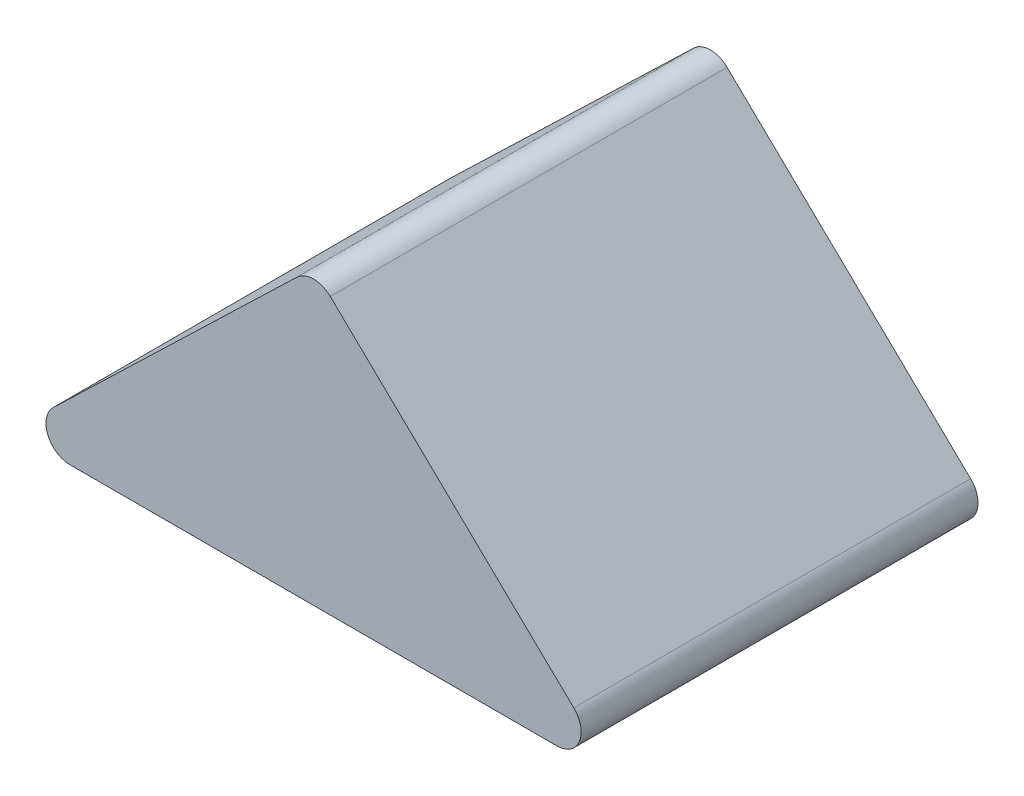
ISO-10303-21;
HEADER;
FILE_DESCRIPTION(('STEP AP214'),'2;1');
FILE_NAME('part.step','',(''),(''),'','','');
FILE_SCHEMA(('AUTOMOTIVE_DESIGN { 1 0 10303 214 1 1 1 1 }'));
ENDSEC;
DATA;
#1=APPLICATION_CONTEXT('core data for automotive mechanical design processes');
#2=APPLICATION_PROTOCOL_DEFINITION('international standard','automotive_design',2000,#1);
#3=PRODUCT_CONTEXT('',#1,'mechanical');
#4=PRODUCT('Part','Part','',(#3));
#5=PRODUCT_RELATED_PRODUCT_CATEGORY('part','',(#4));
#6=PRODUCT_DEFINITION_FORMATION('','',#4);
#7=PRODUCT_DEFINITION_CONTEXT('part definition',#1,'design');
#8=PRODUCT_DEFINITION('design','',#6,#7);
#9=PRODUCT_DEFINITION_SHAPE('','',#8);
#10=(LENGTH_UNIT() NAMED_UNIT(*) SI_UNIT(.MILLI.,.METRE.));
#11=(NAMED_UNIT(*) PLANE_ANGLE_UNIT() SI_UNIT($,.RADIAN.));
#12=(NAMED_UNIT(*) SI_UNIT($,.STERADIAN.) SOLID_ANGLE_UNIT());
#13=UNCERTAINTY_MEASURE_WITH_UNIT(LENGTH_MEASURE(1.E-05),#10,'distance_accuracy_value','');
#14=(GEOMETRIC_REPRESENTATION_CONTEXT(3) GLOBAL_UNCERTAINTY_ASSIGNED_CONTEXT((#13)) GLOBAL_UNIT_ASSIGNED_CONTEXT((#10,
#11,#12)) REPRESENTATION_CONTEXT('',''));
#15=CARTESIAN_POINT('',(0.,0.,0.));
#16=DIRECTION('',(0.,0.,1.));
#17=DIRECTION('',(1.,0.,0.));
#18=AXIS2_PLACEMENT_3D('',#15,#16,#17);
#19=CARTESIAN_POINT('',(0.,2.,33.));
#20=DIRECTION('',(0.,0.,-1.));
#21=DIRECTION('',(-1.,0.,0.));
#22=AXIS2_PLACEMENT_3D('',#19,#20,#21);
#23=CYLINDRICAL_SURFACE('',#22,1.99999999999999);
#24=CARTESIAN_POINT('',(0.,2.,0.));
#25=DIRECTION('',(0.,0.,1.));
#26=DIRECTION('',(1.,0.,0.));
#27=AXIS2_PLACEMENT_3D('',#24,#25,#26);
#28=CIRCLE('',#27,1.99999999999999);
#29=CARTESIAN_POINT('',(-1.38728337413174,3.44064042698295,0.));
#30=VERTEX_POINT('',#29);
#31=CARTESIAN_POINT('',(0.,0.,0.));
#32=VERTEX_POINT('',#31);
#33=EDGE_CURVE('E117',#30,#32,#28,.T.);
#34=ORIENTED_EDGE('',*,*,#33,.T.);
#35=DIRECTION('',(0.,0.,-1.));
#36=VECTOR('',#35,1.);
#37=CARTESIAN_POINT('',(0.,0.,33.));
#38=LINE('',#37,#36);
#39=CARTESIAN_POINT('',(0.,0.,33.));
#40=VERTEX_POINT('',#39);
#41=EDGE_CURVE('E11',#40,#32,#38,.T.);
#42=ORIENTED_EDGE('',*,*,#41,.F.);
#43=CARTESIAN_POINT('',(0.,2.,33.));
#44=DIRECTION('',(0.,0.,1.));
#45=DIRECTION('',(1.,0.,0.));
#46=AXIS2_PLACEMENT_3D('',#43,#44,#45);
#47=CIRCLE('',#46,1.99999999999999);
#48=CARTESIAN_POINT('',(-1.38728337413174,3.44064042698295,33.));
#49=VERTEX_POINT('',#48);
#50=EDGE_CURVE('E127',#49,#40,#47,.T.);
#51=ORIENTED_EDGE('',*,*,#50,.F.);
#52=DIRECTION('',(0.,0.,-1.));
#53=VECTOR('',#52,1.);
#54=CARTESIAN_POINT('',(-1.38728337413174,3.44064042698295,33.));
#55=LINE('',#54,#53);
#56=EDGE_CURVE('E113',#49,#30,#55,.T.);
#57=ORIENTED_EDGE('',*,*,#56,.T.);
#58=EDGE_LOOP('',(#34,#42,#51,#57));
#59=FACE_BOUND('',#58,.T.);
#60=ADVANCED_FACE('F33',(#59),#23,.T.);
#61=CARTESIAN_POINT('',(0.,0.,33.));
#62=DIRECTION('',(0.,1.,0.));
#63=DIRECTION('',(-1.,0.,0.));
#64=AXIS2_PLACEMENT_3D('',#61,#62,#63);
#65=PLANE('',#64);
#66=DIRECTION('',(1.,0.,0.));
#67=VECTOR('',#66,1.);
#68=CARTESIAN_POINT('',(0.,0.,0.));
#69=LINE('',#68,#67);
#70=CARTESIAN_POINT('',(40.5,0.,0.));
#71=VERTEX_POINT('',#70);
#72=EDGE_CURVE('E120',#32,#71,#69,.T.);
#73=ORIENTED_EDGE('',*,*,#72,.T.);
#74=DIRECTION('',(0.,0.,-1.));
#75=VECTOR('',#74,1.);
#76=CARTESIAN_POINT('',(40.5,0.,33.));
#77=LINE('',#76,#75);
#78=CARTESIAN_POINT('',(40.5,0.,33.));
#79=VERTEX_POINT('',#78);
#80=EDGE_CURVE('E41',#79,#71,#77,.T.);
#81=ORIENTED_EDGE('',*,*,#80,.F.);
#82=DIRECTION('',(1.,0.,0.));
#83=VECTOR('',#82,1.);
#84=CARTESIAN_POINT('',(0.,0.,33.));
#85=LINE('',#84,#83);
#86=EDGE_CURVE('E86',#40,#79,#85,.T.);
#87=ORIENTED_EDGE('',*,*,#86,.F.);
#88=ORIENTED_EDGE('',*,*,#41,.T.);
#89=EDGE_LOOP('',(#73,#81,#87,#88));
#90=FACE_BOUND('',#89,.T.);
#91=ADVANCED_FACE('F151',(#90),#65,.F.);
#92=CARTESIAN_POINT('',(40.5,2.,33.));
#93=DIRECTION('',(0.,0.,-1.));
#94=DIRECTION('',(-1.,0.,0.));
#95=AXIS2_PLACEMENT_3D('',#92,#93,#94);
#96=CYLINDRICAL_SURFACE('',#95,1.99999999999999);
#97=CARTESIAN_POINT('',(40.5,2.,0.));
#98=DIRECTION('',(0.,0.,1.));
#99=DIRECTION('',(-1.,0.,0.));
#100=AXIS2_PLACEMENT_3D('',#97,#98,#99);
#101=CIRCLE('',#100,1.99999999999999);
#102=CARTESIAN_POINT('',(41.8872833741317,3.44064042698296,0.));
#103=VERTEX_POINT('',#102);
#104=EDGE_CURVE('E122',#71,#103,#101,.T.);
#105=ORIENTED_EDGE('',*,*,#104,.T.);
#106=DIRECTION('',(0.,0.,-1.));
#107=VECTOR('',#106,1.);
#108=CARTESIAN_POINT('',(41.8872833741317,3.44064042698296,33.));
#109=LINE('',#108,#107);
#110=CARTESIAN_POINT('',(41.8872833741317,3.44064042698296,33.));
#111=VERTEX_POINT('',#110);
#112=EDGE_CURVE('E108',#111,#103,#109,.T.);
#113=ORIENTED_EDGE('',*,*,#112,.F.);
#114=CARTESIAN_POINT('',(40.5,2.,33.));
#115=DIRECTION('',(0.,0.,1.));
#116=DIRECTION('',(-1.,0.,0.));
#117=AXIS2_PLACEMENT_3D('',#114,#115,#116);
#118=CIRCLE('',#117,1.99999999999999);
#119=EDGE_CURVE('E99',#79,#111,#118,.T.);
#120=ORIENTED_EDGE('',*,*,#119,.F.);
#121=ORIENTED_EDGE('',*,*,#80,.T.);
#122=EDGE_LOOP('',(#105,#113,#120,#121));
#123=FACE_BOUND('',#122,.T.);
#124=ADVANCED_FACE('F133',(#123),#96,.T.);
#125=CARTESIAN_POINT('',(41.8872833741317,3.44064042698296,33.));
#126=DIRECTION('',(-0.693641687065871,-0.720320213491481,0.));
#127=DIRECTION('',(0.720320213491481,-0.693641687065871,0.));
#128=AXIS2_PLACEMENT_3D('',#125,#126,#127);
#129=PLANE('',#128);
#130=DIRECTION('',(-0.720320213491481,0.693641687065871,0.));
#131=VECTOR('',#130,1.);
#132=CARTESIAN_POINT('',(41.8872833741317,3.44064042698296,0.));
#133=LINE('',#132,#131);
#134=CARTESIAN_POINT('',(21.6372833741317,22.940640426983,0.));
#135=VERTEX_POINT('',#134);
#136=EDGE_CURVE('E107',#103,#135,#133,.T.);
#137=ORIENTED_EDGE('',*,*,#136,.T.);
#138=DIRECTION('',(0.,0.,-1.));
#139=VECTOR('',#138,1.);
#140=CARTESIAN_POINT('',(21.6372833741317,22.940640426983,33.));
#141=LINE('',#140,#139);
#142=CARTESIAN_POINT('',(21.6372833741317,22.940640426983,33.));
#143=VERTEX_POINT('',#142);
#144=EDGE_CURVE('E104',#143,#135,#141,.T.);
#145=ORIENTED_EDGE('',*,*,#144,.F.);
#146=DIRECTION('',(-0.720320213491481,0.693641687065871,0.));
#147=VECTOR('',#146,1.);
#148=CARTESIAN_POINT('',(41.8872833741317,3.44064042698296,33.));
#149=LINE('',#148,#147);
#150=EDGE_CURVE('E93',#111,#143,#149,.T.);
#151=ORIENTED_EDGE('',*,*,#150,.F.);
#152=ORIENTED_EDGE('',*,*,#112,.T.);
#153=EDGE_LOOP('',(#137,#145,#151,#152));
#154=FACE_BOUND('',#153,.T.);
#155=ADVANCED_FACE('F105',(#154),#129,.F.);
#156=CARTESIAN_POINT('',(20.25,21.5,33.));
#157=DIRECTION('',(0.,0.,-1.));
#158=DIRECTION('',(-1.,0.,0.));
#159=AXIS2_PLACEMENT_3D('',#156,#157,#158);
#160=CYLINDRICAL_SURFACE('',#159,2.);
#161=CARTESIAN_POINT('',(20.25,21.5,0.));
#162=DIRECTION('',(0.,0.,1.));
#163=DIRECTION('',(1.,0.,0.));
#164=AXIS2_PLACEMENT_3D('',#161,#162,#163);
#165=CIRCLE('',#164,2.);
#166=CARTESIAN_POINT('',(18.8627166258683,22.940640426983,0.));
#167=VERTEX_POINT('',#166);
#168=EDGE_CURVE('E72',#135,#167,#165,.T.);
#169=ORIENTED_EDGE('',*,*,#168,.T.);
#170=DIRECTION('',(0.,0.,-1.));
#171=VECTOR('',#170,1.);
#172=CARTESIAN_POINT('',(18.8627166258683,22.940640426983,33.));
#173=LINE('',#172,#171);
#174=CARTESIAN_POINT('',(18.8627166258683,22.940640426983,33.));
#175=VERTEX_POINT('',#174);
#176=EDGE_CURVE('E109',#175,#167,#173,.T.);
#177=ORIENTED_EDGE('',*,*,#176,.F.);
#178=CARTESIAN_POINT('',(20.25,21.5,33.));
#179=DIRECTION('',(0.,0.,1.));
#180=DIRECTION('',(1.,0.,0.));
#181=AXIS2_PLACEMENT_3D('',#178,#179,#180);
#182=CIRCLE('',#181,2.);
#183=EDGE_CURVE('E97',#143,#175,#182,.T.);
#184=ORIENTED_EDGE('',*,*,#183,.F.);
#185=ORIENTED_EDGE('',*,*,#144,.T.);
#186=EDGE_LOOP('',(#169,#177,#184,#185));
#187=FACE_BOUND('',#186,.T.);
#188=ADVANCED_FACE('F111',(#187),#160,.T.);
#189=CARTESIAN_POINT('',(18.8627166258683,22.940640426983,33.));
#190=DIRECTION('',(0.693641687065871,-0.720320213491481,0.));
#191=DIRECTION('',(0.720320213491481,0.693641687065871,0.));
#192=AXIS2_PLACEMENT_3D('',#189,#190,#191);
#193=PLANE('',#192);
#194=DIRECTION('',(-0.720320213491481,-0.693641687065871,0.));
#195=VECTOR('',#194,1.);
#196=CARTESIAN_POINT('',(18.8627166258683,22.940640426983,0.));
#197=LINE('',#196,#195);
#198=EDGE_CURVE('E78',#167,#30,#197,.T.);
#199=ORIENTED_EDGE('',*,*,#198,.T.);
#200=ORIENTED_EDGE('',*,*,#56,.F.);
#201=DIRECTION('',(-0.720320213491481,-0.693641687065871,0.));
#202=VECTOR('',#201,1.);
#203=CARTESIAN_POINT('',(18.8627166258683,22.940640426983,33.));
#204=LINE('',#203,#202);
#205=EDGE_CURVE('E49',#175,#49,#204,.T.);
#206=ORIENTED_EDGE('',*,*,#205,.F.);
#207=ORIENTED_EDGE('',*,*,#176,.T.);
#208=EDGE_LOOP('',(#199,#200,#206,#207));
#209=FACE_BOUND('',#208,.T.);
#210=ADVANCED_FACE('F140',(#209),#193,.F.);
#211=CARTESIAN_POINT('',(0.,2.,33.));
#212=DIRECTION('',(0.,0.,1.));
#213=DIRECTION('',(1.,0.,0.));
#214=AXIS2_PLACEMENT_3D('',#211,#212,#213);
#215=PLANE('',#214);
#216=ORIENTED_EDGE('',*,*,#50,.T.);
#217=ORIENTED_EDGE('',*,*,#86,.T.);
#218=ORIENTED_EDGE('',*,*,#119,.T.);
#219=ORIENTED_EDGE('',*,*,#150,.T.);
#220=ORIENTED_EDGE('',*,*,#183,.T.);
#221=ORIENTED_EDGE('',*,*,#205,.T.);
#222=EDGE_LOOP('',(#216,#217,#218,#219,#220,#221));
#223=FACE_BOUND('',#222,.T.);
#224=ADVANCED_FACE('F95',(#223),#215,.T.);
#225=CARTESIAN_POINT('',(0.,2.,0.));
#226=DIRECTION('',(0.,0.,1.));
#227=DIRECTION('',(1.,0.,0.));
#228=AXIS2_PLACEMENT_3D('',#225,#226,#227);
#229=PLANE('',#228);
#230=ORIENTED_EDGE('',*,*,#33,.F.);
#231=ORIENTED_EDGE('',*,*,#198,.F.);
#232=ORIENTED_EDGE('',*,*,#168,.F.);
#233=ORIENTED_EDGE('',*,*,#136,.F.);
#234=ORIENTED_EDGE('',*,*,#104,.F.);
#235=ORIENTED_EDGE('',*,*,#72,.F.);
#236=EDGE_LOOP('',(#230,#231,#232,#233,#234,#235));
#237=FACE_BOUND('',#236,.T.);
#238=ADVANCED_FACE('F136',(#237),#229,.F.);
#239=CLOSED_SHELL('',(#60,#91,#124,#155,#188,#210,#224,#238));
#240=MANIFOLD_SOLID_BREP('B2',#239);
#241=ADVANCED_BREP_SHAPE_REPRESENTATION('',(#18,#240),#14);
#242=SHAPE_DEFINITION_REPRESENTATION(#9,#241);
ENDSEC;
END-ISO-10303-21;
